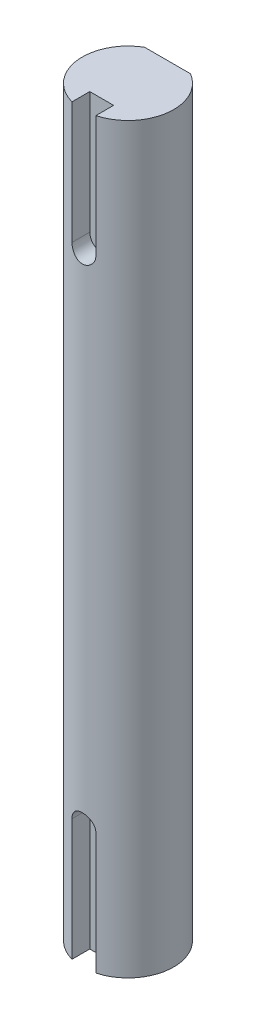
ISO-10303-21;
HEADER;
FILE_DESCRIPTION(('STEP AP214'),'2;1');
FILE_NAME('part.step','',(''),(''),'','','');
FILE_SCHEMA(('AUTOMOTIVE_DESIGN { 1 0 10303 214 1 1 1 1 }'));
ENDSEC;
DATA;
#1=APPLICATION_CONTEXT('core data for automotive mechanical design processes');
#2=APPLICATION_PROTOCOL_DEFINITION('international standard','automotive_design',2000,#1);
#3=PRODUCT_CONTEXT('',#1,'mechanical');
#4=PRODUCT('Part','Part','',(#3));
#5=PRODUCT_RELATED_PRODUCT_CATEGORY('part','',(#4));
#6=PRODUCT_DEFINITION_FORMATION('','',#4);
#7=PRODUCT_DEFINITION_CONTEXT('part definition',#1,'design');
#8=PRODUCT_DEFINITION('design','',#6,#7);
#9=PRODUCT_DEFINITION_SHAPE('','',#8);
#10=(LENGTH_UNIT() NAMED_UNIT(*) SI_UNIT(.MILLI.,.METRE.));
#11=(NAMED_UNIT(*) PLANE_ANGLE_UNIT() SI_UNIT($,.RADIAN.));
#12=(NAMED_UNIT(*) SI_UNIT($,.STERADIAN.) SOLID_ANGLE_UNIT());
#13=UNCERTAINTY_MEASURE_WITH_UNIT(LENGTH_MEASURE(1.E-05),#10,'distance_accuracy_value','');
#14=(GEOMETRIC_REPRESENTATION_CONTEXT(3) GLOBAL_UNCERTAINTY_ASSIGNED_CONTEXT((#13)) GLOBAL_UNIT_ASSIGNED_CONTEXT((#10,
#11,#12)) REPRESENTATION_CONTEXT('',''));
#15=CARTESIAN_POINT('',(0.,0.,0.));
#16=DIRECTION('',(0.,0.,1.));
#17=DIRECTION('',(1.,0.,0.));
#18=AXIS2_PLACEMENT_3D('',#15,#16,#17);
#19=CARTESIAN_POINT('',(0.,-38.735,0.));
#20=DIRECTION('',(0.,1.,0.));
#21=DIRECTION('',(0.,0.,1.));
#22=AXIS2_PLACEMENT_3D('',#19,#20,#21);
#23=CYLINDRICAL_SURFACE('',#22,4.7625);
#24=DIRECTION('',(0.,1.,0.));
#25=VECTOR('',#24,1.);
#26=CARTESIAN_POINT('',(1.24459999999999,-38.735,4.5969965292569));
#27=LINE('',#26,#25);
#28=CARTESIAN_POINT('',(1.2446,26.035,4.5969965292569));
#29=VERTEX_POINT('',#28);
#30=CARTESIAN_POINT('',(1.2446,38.735,4.5969965292569));
#31=VERTEX_POINT('',#30);
#32=EDGE_CURVE('E152',#29,#31,#27,.T.);
#33=ORIENTED_EDGE('',*,*,#32,.F.);
#34=CARTESIAN_POINT('',(1.2446,26.035,4.5969965292569));
#35=CARTESIAN_POINT('',(1.24460048069691,26.0006255628231,4.59699408376007));
#36=CARTESIAN_POINT('',(1.24317501700129,25.966268215999,4.5973825759876));
#37=CARTESIAN_POINT('',(1.23749293849502,25.8978115705428,4.59891621742561));
#38=CARTESIAN_POINT('',(1.23323683326576,25.8637122265814,4.60006123044449));
#39=CARTESIAN_POINT('',(1.21628657128937,25.7623198325488,4.60458446129686));
#40=CARTESIAN_POINT('',(1.19941017764007,25.6957252822143,4.60905116855804));
#41=CARTESIAN_POINT('',(1.15505827670811,25.5664412354433,4.62036394290255));
#42=CARTESIAN_POINT('',(1.12758433099319,25.5037511652548,4.62720965942));
#43=CARTESIAN_POINT('',(1.06285289634498,25.3838354583918,4.64250499373342));
#44=CARTESIAN_POINT('',(1.02559237402981,25.3266115234763,4.65095510859255));
#45=CARTESIAN_POINT('',(0.941398979907101,25.2179168005052,4.66873215221298));
#46=CARTESIAN_POINT('',(0.894275059322025,25.1665964795985,4.67807404656334));
#47=CARTESIAN_POINT('',(0.792099451869523,25.0724863600209,4.69645346192189));
#48=CARTESIAN_POINT('',(0.737046487215499,25.0296979389436,4.70549093358134));
#49=CARTESIAN_POINT('',(0.619532028480514,24.9532437325057,4.72241023124279));
#50=CARTESIAN_POINT('',(0.556969876173491,24.9197278955072,4.73027221144797));
#51=CARTESIAN_POINT('',(0.426862239969756,24.863748321937,4.74378179788506));
#52=CARTESIAN_POINT('',(0.359317803810612,24.8412822692537,4.74942986811743));
#53=CARTESIAN_POINT('',(0.222739671845817,24.8085259648376,4.75776932421329));
#54=CARTESIAN_POINT('',(0.153771576200012,24.7979783557913,4.76052311140348));
#55=CARTESIAN_POINT('',(0.0149919824848408,24.7885491757278,4.7629816983899));
#56=CARTESIAN_POINT('',(-0.0548193968975559,24.7896659816924,4.76268692237153));
#57=CARTESIAN_POINT('',(-0.191511566074036,24.8033518915091,4.75912743579705));
#58=CARTESIAN_POINT('',(-0.258422375590347,24.8156427819586,4.75593487759589));
#59=CARTESIAN_POINT('',(-0.389196035092339,24.850879106172,4.74702336680663));
#60=CARTESIAN_POINT('',(-0.4530587433749,24.8738250347469,4.74130429689009));
#61=CARTESIAN_POINT('',(-0.576642455622934,24.929937439557,4.72787417183306));
#62=CARTESIAN_POINT('',(-0.63631745814736,24.9632005654322,4.72014439617784));
#63=CARTESIAN_POINT('',(-0.749333048347102,25.0389287146211,4.70352780085098));
#64=CARTESIAN_POINT('',(-0.802672575468966,25.0813952752311,4.69464078797928));
#65=CARTESIAN_POINT('',(-0.903159231271162,25.1758006923784,4.67636584182586));
#66=CARTESIAN_POINT('',(-0.950078078364809,25.2279814181199,4.6669708633435));
#67=CARTESIAN_POINT('',(-1.03456387629524,25.3395829088986,4.64897360387142));
#68=CARTESIAN_POINT('',(-1.07212825101057,25.3990056616171,4.64037154165222));
#69=CARTESIAN_POINT('',(-1.13700674989337,25.5238939038961,4.62490490570996));
#70=CARTESIAN_POINT('',(-1.164255378317,25.589394821719,4.61805152116702));
#71=CARTESIAN_POINT('',(-1.20724593796408,25.7242334511026,4.6070016754561));
#72=CARTESIAN_POINT('',(-1.22300512439392,25.7935652401585,4.60280123129246));
#73=CARTESIAN_POINT('',(-1.23670202917591,25.8920901866401,4.59912882560274));
#74=CARTESIAN_POINT('',(-1.23966411940503,25.9206090697454,4.59833055320323));
#75=CARTESIAN_POINT('',(-1.2436109644293,25.9777473867567,4.59726458179524));
#76=CARTESIAN_POINT('',(-1.2445988719784,26.0063665871042,4.59699603682516));
#77=CARTESIAN_POINT('',(-1.2446,26.035,4.5969965292569));
#78=B_SPLINE_CURVE_WITH_KNOTS('',3,(#34,#35,#36,#37,#38,#39,#40,#41,#42,#43,#44,#45,#46,#47,#48,
#49,#50,#51,#52,#53,#54,#55,#56,#57,#58,#59,#60,#61,#62,#63,#64,#65,#66,#67,#68,#69,#70,#71,#72,
#73,#74,#75,#76,#77),.UNSPECIFIED.,.F.,.F.,(4,2,2,2,2,2,2,2,2,2,2,2,2,2,2,2,2,2,2,2,2,4),(0.,
0.103057985094989,0.206097422372695,0.411563016689937,0.616998346852772,0.822497427674441,
1.03242281078854,1.24238206186975,1.45556084737979,1.66869493007218,1.87713314182961,
2.085542351316,2.28890056394074,2.49226822129154,2.69760166578283,2.90296943462697,
3.11437766883767,3.32584405838716,3.53863140900513,3.7510985268427,3.83708969411534,
3.92294342408338),.UNSPECIFIED.);
#79=CARTESIAN_POINT('',(-1.2446,26.035,4.5969965292569));
#80=VERTEX_POINT('',#79);
#81=EDGE_CURVE('E12',#29,#80,#78,.T.);
#82=ORIENTED_EDGE('',*,*,#81,.T.);
#83=DIRECTION('',(0.,1.,0.));
#84=VECTOR('',#83,1.);
#85=CARTESIAN_POINT('',(-1.2446,-38.735,4.5969965292569));
#86=LINE('',#85,#84);
#87=CARTESIAN_POINT('',(-1.2446,38.735,4.5969965292569));
#88=VERTEX_POINT('',#87);
#89=EDGE_CURVE('E150',#80,#88,#86,.T.);
#90=ORIENTED_EDGE('',*,*,#89,.T.);
#91=CARTESIAN_POINT('',(0.,38.735,0.));
#92=DIRECTION('',(0.,1.,0.));
#93=DIRECTION('',(0.,0.,1.));
#94=AXIS2_PLACEMENT_3D('',#91,#92,#93);
#95=CIRCLE('',#94,4.7625);
#96=CARTESIAN_POINT('',(-2.3876,38.735,-4.12077328786722));
#97=VERTEX_POINT('',#96);
#98=EDGE_CURVE('E193',#97,#88,#95,.T.);
#99=ORIENTED_EDGE('',*,*,#98,.F.);
#100=DIRECTION('',(0.,1.,0.));
#101=VECTOR('',#100,1.);
#102=CARTESIAN_POINT('',(-2.3876,-38.735,-4.12077328786722));
#103=LINE('',#102,#101);
#104=CARTESIAN_POINT('',(-2.3876,-38.735,-4.12077328786722));
#105=VERTEX_POINT('',#104);
#106=EDGE_CURVE('E203',#105,#97,#103,.T.);
#107=ORIENTED_EDGE('',*,*,#106,.F.);
#108=CARTESIAN_POINT('',(0.,-38.735,0.));
#109=DIRECTION('',(0.,1.,0.));
#110=DIRECTION('',(0.,0.,1.));
#111=AXIS2_PLACEMENT_3D('',#108,#109,#110);
#112=CIRCLE('',#111,4.7625);
#113=CARTESIAN_POINT('',(-1.2446,-38.735,4.5969965292569));
#114=VERTEX_POINT('',#113);
#115=EDGE_CURVE('E200',#105,#114,#112,.T.);
#116=ORIENTED_EDGE('',*,*,#115,.T.);
#117=DIRECTION('',(0.,1.,0.));
#118=VECTOR('',#117,1.);
#119=CARTESIAN_POINT('',(-1.2446,-38.735,4.5969965292569));
#120=LINE('',#119,#118);
#121=CARTESIAN_POINT('',(-1.2446,-26.035,4.5969965292569));
#122=VERTEX_POINT('',#121);
#123=EDGE_CURVE('E80',#122,#114,#120,.F.);
#124=ORIENTED_EDGE('',*,*,#123,.F.);
#125=CARTESIAN_POINT('',(-1.2446,-26.035,4.5969965292569));
#126=CARTESIAN_POINT('',(-1.24460048069691,-26.0006255628231,4.59699408376007));
#127=CARTESIAN_POINT('',(-1.24317501700129,-25.966268215999,4.5973825759876));
#128=CARTESIAN_POINT('',(-1.23749293849502,-25.8978115705428,4.59891621742561));
#129=CARTESIAN_POINT('',(-1.23323683326577,-25.8637122265814,4.60006123044449));
#130=CARTESIAN_POINT('',(-1.21628657128937,-25.7623198325488,4.60458446129686));
#131=CARTESIAN_POINT('',(-1.19941017764007,-25.6957252822143,4.60905116855804));
#132=CARTESIAN_POINT('',(-1.15505827670811,-25.5664412354433,4.62036394290254));
#133=CARTESIAN_POINT('',(-1.12758433099319,-25.5037511652548,4.62720965942));
#134=CARTESIAN_POINT('',(-1.06285289634498,-25.3838354583918,4.64250499373342));
#135=CARTESIAN_POINT('',(-1.02559237402982,-25.3266115234763,4.65095510859255));
#136=CARTESIAN_POINT('',(-0.941398979907102,-25.2179168005052,4.66873215221298));
#137=CARTESIAN_POINT('',(-0.894275059322026,-25.1665964795985,4.67807404656334));
#138=CARTESIAN_POINT('',(-0.792099451869525,-25.0724863600209,4.69645346192189));
#139=CARTESIAN_POINT('',(-0.737046487215504,-25.0296979389436,4.70549093358134));
#140=CARTESIAN_POINT('',(-0.619532028480519,-24.9532437325057,4.72241023124279));
#141=CARTESIAN_POINT('',(-0.556969876173495,-24.9197278955072,4.73027221144797));
#142=CARTESIAN_POINT('',(-0.426862239969759,-24.863748321937,4.74378179788506));
#143=CARTESIAN_POINT('',(-0.359317803810614,-24.8412822692537,4.74942986811743));
#144=CARTESIAN_POINT('',(-0.222739671845819,-24.8085259648376,4.75776932421329));
#145=CARTESIAN_POINT('',(-0.153771576200013,-24.7979783557913,4.76052311140348));
#146=CARTESIAN_POINT('',(-0.014991982484842,-24.7885491757278,4.7629816983899));
#147=CARTESIAN_POINT('',(0.0548193968975547,-24.7896659816924,4.76268692237153));
#148=CARTESIAN_POINT('',(0.191511566074035,-24.8033518915091,4.75912743579705));
#149=CARTESIAN_POINT('',(0.258422375590346,-24.8156427819586,4.75593487759589));
#150=CARTESIAN_POINT('',(0.389196035092338,-24.850879106172,4.74702336680663));
#151=CARTESIAN_POINT('',(0.4530587433749,-24.8738250347469,4.74130429689009));
#152=CARTESIAN_POINT('',(0.576642455622933,-24.929937439557,4.72787417183306));
#153=CARTESIAN_POINT('',(0.63631745814736,-24.9632005654322,4.72014439617784));
#154=CARTESIAN_POINT('',(0.749333048347103,-25.0389287146211,4.70352780085098));
#155=CARTESIAN_POINT('',(0.802672575468967,-25.0813952752311,4.69464078797928));
#156=CARTESIAN_POINT('',(0.903159231271163,-25.1758006923784,4.67636584182586));
#157=CARTESIAN_POINT('',(0.950078078364809,-25.2279814181199,4.6669708633435));
#158=CARTESIAN_POINT('',(1.03456387629524,-25.3395829088986,4.64897360387142));
#159=CARTESIAN_POINT('',(1.07212825101057,-25.3990056616171,4.64037154165222));
#160=CARTESIAN_POINT('',(1.13700674989337,-25.5238939038961,4.62490490570996));
#161=CARTESIAN_POINT('',(1.164255378317,-25.589394821719,4.61805152116702));
#162=CARTESIAN_POINT('',(1.20724593796408,-25.7242334511027,4.6070016754561));
#163=CARTESIAN_POINT('',(1.22300512439392,-25.7935652401585,4.60280123129246));
#164=CARTESIAN_POINT('',(1.23670202917591,-25.8920901866401,4.59912882560274));
#165=CARTESIAN_POINT('',(1.23966411940503,-25.9206090697454,4.59833055320323));
#166=CARTESIAN_POINT('',(1.24361096442929,-25.9777473867567,4.59726458179524));
#167=CARTESIAN_POINT('',(1.2445988719784,-26.0063665871042,4.59699603682516));
#168=CARTESIAN_POINT('',(1.2446,-26.035,4.5969965292569));
#169=B_SPLINE_CURVE_WITH_KNOTS('',3,(#125,#126,#127,#128,#129,#130,#131,#132,#133,#134,#135,
#136,#137,#138,#139,#140,#141,#142,#143,#144,#145,#146,#147,#148,#149,#150,#151,#152,#153,#154,
#155,#156,#157,#158,#159,#160,#161,#162,#163,#164,#165,#166,#167,#168),.UNSPECIFIED.,.F.,.F.,(4,
2,2,2,2,2,2,2,2,2,2,2,2,2,2,2,2,2,2,2,2,4),(0.,0.103057985094989,0.206097422372695,
0.411563016689937,0.616998346852772,0.822497427674441,1.03242281078854,1.24238206186975,
1.45556084737979,1.66869493007218,1.87713314182961,2.085542351316,2.28890056394074,
2.49226822129154,2.69760166578283,2.90296943462698,3.11437766883767,3.32584405838715,
3.53863140900514,3.7510985268427,3.83708969411534,3.92294342408338),.UNSPECIFIED.);
#170=CARTESIAN_POINT('',(1.2446,-26.035,4.5969965292569));
#171=VERTEX_POINT('',#170);
#172=EDGE_CURVE('E73',#122,#171,#169,.T.);
#173=ORIENTED_EDGE('',*,*,#172,.T.);
#174=DIRECTION('',(0.,1.,0.));
#175=VECTOR('',#174,1.);
#176=CARTESIAN_POINT('',(1.2446,-38.735,4.5969965292569));
#177=LINE('',#176,#175);
#178=CARTESIAN_POINT('',(1.2446,-38.735,4.5969965292569));
#179=VERTEX_POINT('',#178);
#180=EDGE_CURVE('E186',#171,#179,#177,.F.);
#181=ORIENTED_EDGE('',*,*,#180,.T.);
#182=CARTESIAN_POINT('',(2.3876,-38.735,-4.12077328786722));
#183=VERTEX_POINT('',#182);
#184=EDGE_CURVE('E199',#179,#183,#112,.T.);
#185=ORIENTED_EDGE('',*,*,#184,.T.);
#186=DIRECTION('',(0.,1.,0.));
#187=VECTOR('',#186,1.);
#188=CARTESIAN_POINT('',(2.3876,-38.735,-4.12077328786722));
#189=LINE('',#188,#187);
#190=CARTESIAN_POINT('',(2.3876,38.735,-4.12077328786722));
#191=VERTEX_POINT('',#190);
#192=EDGE_CURVE('E204',#183,#191,#189,.T.);
#193=ORIENTED_EDGE('',*,*,#192,.T.);
#194=EDGE_CURVE('E192',#31,#191,#95,.T.);
#195=ORIENTED_EDGE('',*,*,#194,.F.);
#196=EDGE_LOOP('',(#33,#82,#90,#99,#107,#116,#124,#173,#181,#185,#193,#195));
#197=FACE_BOUND('',#196,.T.);
#198=ADVANCED_FACE('F60',(#197),#23,.T.);
#199=CARTESIAN_POINT('',(0.,-38.735,0.));
#200=DIRECTION('',(0.,1.,0.));
#201=DIRECTION('',(0.,0.,1.));
#202=AXIS2_PLACEMENT_3D('',#199,#200,#201);
#203=PLANE('',#202);
#204=DIRECTION('',(0.,0.,1.));
#205=VECTOR('',#204,1.);
#206=CARTESIAN_POINT('',(1.2446,-38.735,0.));
#207=LINE('',#206,#205);
#208=CARTESIAN_POINT('',(1.2446,-38.735,2.7432));
#209=VERTEX_POINT('',#208);
#210=EDGE_CURVE('E214',#209,#179,#207,.T.);
#211=ORIENTED_EDGE('',*,*,#210,.F.);
#212=DIRECTION('',(1.,0.,0.));
#213=VECTOR('',#212,1.);
#214=CARTESIAN_POINT('',(0.,-38.735,2.7432));
#215=LINE('',#214,#213);
#216=CARTESIAN_POINT('',(-1.2446,-38.735,2.7432));
#217=VERTEX_POINT('',#216);
#218=EDGE_CURVE('E176',#217,#209,#215,.T.);
#219=ORIENTED_EDGE('',*,*,#218,.F.);
#220=DIRECTION('',(0.,0.,1.));
#221=VECTOR('',#220,1.);
#222=CARTESIAN_POINT('',(-1.2446,-38.735,0.));
#223=LINE('',#222,#221);
#224=EDGE_CURVE('E212',#217,#114,#223,.T.);
#225=ORIENTED_EDGE('',*,*,#224,.T.);
#226=ORIENTED_EDGE('',*,*,#115,.F.);
#227=DIRECTION('',(1.,0.,0.));
#228=VECTOR('',#227,1.);
#229=CARTESIAN_POINT('',(0.,-38.735,-4.12077328786722));
#230=LINE('',#229,#228);
#231=EDGE_CURVE('E196',#105,#183,#230,.T.);
#232=ORIENTED_EDGE('',*,*,#231,.T.);
#233=ORIENTED_EDGE('',*,*,#184,.F.);
#234=EDGE_LOOP('',(#211,#219,#225,#226,#232,#233));
#235=FACE_BOUND('',#234,.T.);
#236=ADVANCED_FACE('F242',(#235),#203,.F.);
#237=CARTESIAN_POINT('',(0.,38.735,0.));
#238=DIRECTION('',(0.,1.,0.));
#239=DIRECTION('',(0.,0.,1.));
#240=AXIS2_PLACEMENT_3D('',#237,#238,#239);
#241=PLANE('',#240);
#242=ORIENTED_EDGE('',*,*,#98,.T.);
#243=DIRECTION('',(0.,0.,-1.));
#244=VECTOR('',#243,1.);
#245=CARTESIAN_POINT('',(-1.2446,38.735,0.));
#246=LINE('',#245,#244);
#247=CARTESIAN_POINT('',(-1.2446,38.735,2.7432));
#248=VERTEX_POINT('',#247);
#249=EDGE_CURVE('E210',#88,#248,#246,.T.);
#250=ORIENTED_EDGE('',*,*,#249,.T.);
#251=DIRECTION('',(1.,0.,0.));
#252=VECTOR('',#251,1.);
#253=CARTESIAN_POINT('',(0.,38.735,2.7432));
#254=LINE('',#253,#252);
#255=CARTESIAN_POINT('',(1.2446,38.735,2.7432));
#256=VERTEX_POINT('',#255);
#257=EDGE_CURVE('E161',#248,#256,#254,.T.);
#258=ORIENTED_EDGE('',*,*,#257,.T.);
#259=DIRECTION('',(0.,0.,-1.));
#260=VECTOR('',#259,1.);
#261=CARTESIAN_POINT('',(1.2446,38.735,0.));
#262=LINE('',#261,#260);
#263=EDGE_CURVE('E207',#31,#256,#262,.T.);
#264=ORIENTED_EDGE('',*,*,#263,.F.);
#265=ORIENTED_EDGE('',*,*,#194,.T.);
#266=DIRECTION('',(1.,0.,0.));
#267=VECTOR('',#266,1.);
#268=CARTESIAN_POINT('',(0.,38.735,-4.12077328786722));
#269=LINE('',#268,#267);
#270=EDGE_CURVE('E189',#97,#191,#269,.T.);
#271=ORIENTED_EDGE('',*,*,#270,.F.);
#272=EDGE_LOOP('',(#242,#250,#258,#264,#265,#271));
#273=FACE_BOUND('',#272,.T.);
#274=ADVANCED_FACE('F240',(#273),#241,.T.);
#275=CARTESIAN_POINT('',(0.,-38.735,-4.12077328786722));
#276=DIRECTION('',(0.,0.,1.));
#277=DIRECTION('',(1.,0.,0.));
#278=AXIS2_PLACEMENT_3D('',#275,#276,#277);
#279=PLANE('',#278);
#280=ORIENTED_EDGE('',*,*,#106,.T.);
#281=ORIENTED_EDGE('',*,*,#270,.T.);
#282=ORIENTED_EDGE('',*,*,#192,.F.);
#283=ORIENTED_EDGE('',*,*,#231,.F.);
#284=EDGE_LOOP('',(#280,#281,#282,#283));
#285=FACE_BOUND('',#284,.T.);
#286=ADVANCED_FACE('F62',(#285),#279,.F.);
#287=CARTESIAN_POINT('',(-1.2446,0.,4.7625));
#288=DIRECTION('',(1.,0.,0.));
#289=DIRECTION('',(0.,1.,0.));
#290=AXIS2_PLACEMENT_3D('',#287,#288,#289);
#291=PLANE('',#290);
#292=DIRECTION('',(0.,0.,-1.));
#293=VECTOR('',#292,1.);
#294=CARTESIAN_POINT('',(-1.2446,26.035,4.7625));
#295=LINE('',#294,#293);
#296=CARTESIAN_POINT('',(-1.2446,26.035,2.7432));
#297=VERTEX_POINT('',#296);
#298=EDGE_CURVE('E144',#80,#297,#295,.T.);
#299=ORIENTED_EDGE('',*,*,#298,.T.);
#300=DIRECTION('',(0.,-1.,0.));
#301=VECTOR('',#300,1.);
#302=CARTESIAN_POINT('',(-1.2446,0.,2.7432));
#303=LINE('',#302,#301);
#304=EDGE_CURVE('E148',#248,#297,#303,.T.);
#305=ORIENTED_EDGE('',*,*,#304,.F.);
#306=ORIENTED_EDGE('',*,*,#249,.F.);
#307=ORIENTED_EDGE('',*,*,#89,.F.);
#308=EDGE_LOOP('',(#299,#305,#306,#307));
#309=FACE_BOUND('',#308,.T.);
#310=ADVANCED_FACE('F146',(#309),#291,.T.);
#311=CARTESIAN_POINT('',(0.,26.035,4.7625));
#312=DIRECTION('',(0.,0.,-1.));
#313=DIRECTION('',(-1.,0.,0.));
#314=AXIS2_PLACEMENT_3D('',#311,#312,#313);
#315=CYLINDRICAL_SURFACE('',#314,1.2446);
#316=DIRECTION('',(0.,0.,-1.));
#317=VECTOR('',#316,1.);
#318=CARTESIAN_POINT('',(1.2446,26.035,4.7625));
#319=LINE('',#318,#317);
#320=CARTESIAN_POINT('',(1.2446,26.035,2.7432));
#321=VERTEX_POINT('',#320);
#322=EDGE_CURVE('E153',#29,#321,#319,.T.);
#323=ORIENTED_EDGE('',*,*,#322,.T.);
#324=CARTESIAN_POINT('',(0.,26.035,2.7432));
#325=DIRECTION('',(0.,0.,1.));
#326=DIRECTION('',(1.,0.,0.));
#327=AXIS2_PLACEMENT_3D('',#324,#325,#326);
#328=CIRCLE('',#327,1.2446);
#329=EDGE_CURVE('E155',#297,#321,#328,.T.);
#330=ORIENTED_EDGE('',*,*,#329,.F.);
#331=ORIENTED_EDGE('',*,*,#298,.F.);
#332=ORIENTED_EDGE('',*,*,#81,.F.);
#333=EDGE_LOOP('',(#323,#330,#331,#332));
#334=FACE_BOUND('',#333,.T.);
#335=ADVANCED_FACE('F156',(#334),#315,.F.);
#336=CARTESIAN_POINT('',(1.24459999999999,0.,4.7625));
#337=DIRECTION('',(1.,0.,0.));
#338=DIRECTION('',(0.,1.,0.));
#339=AXIS2_PLACEMENT_3D('',#336,#337,#338);
#340=PLANE('',#339);
#341=ORIENTED_EDGE('',*,*,#32,.T.);
#342=ORIENTED_EDGE('',*,*,#263,.T.);
#343=DIRECTION('',(0.,-1.,0.));
#344=VECTOR('',#343,1.);
#345=CARTESIAN_POINT('',(1.24459999999999,0.,2.7432));
#346=LINE('',#345,#344);
#347=EDGE_CURVE('E88',#256,#321,#346,.T.);
#348=ORIENTED_EDGE('',*,*,#347,.T.);
#349=ORIENTED_EDGE('',*,*,#322,.F.);
#350=EDGE_LOOP('',(#341,#342,#348,#349));
#351=FACE_BOUND('',#350,.T.);
#352=ADVANCED_FACE('F267',(#351),#340,.F.);
#353=CARTESIAN_POINT('',(0.,0.,2.7432));
#354=DIRECTION('',(0.,0.,1.));
#355=DIRECTION('',(1.,0.,0.));
#356=AXIS2_PLACEMENT_3D('',#353,#354,#355);
#357=PLANE('',#356);
#358=ORIENTED_EDGE('',*,*,#304,.T.);
#359=ORIENTED_EDGE('',*,*,#329,.T.);
#360=ORIENTED_EDGE('',*,*,#347,.F.);
#361=ORIENTED_EDGE('',*,*,#257,.F.);
#362=EDGE_LOOP('',(#358,#359,#360,#361));
#363=FACE_BOUND('',#362,.T.);
#364=ADVANCED_FACE('F159',(#363),#357,.T.);
#365=CARTESIAN_POINT('',(0.,0.,2.7432));
#366=DIRECTION('',(0.,0.,1.));
#367=DIRECTION('',(1.,0.,0.));
#368=AXIS2_PLACEMENT_3D('',#365,#366,#367);
#369=PLANE('',#368);
#370=CARTESIAN_POINT('',(0.,-26.035,2.7432));
#371=DIRECTION('',(0.,0.,1.));
#372=DIRECTION('',(1.,0.,0.));
#373=AXIS2_PLACEMENT_3D('',#370,#371,#372);
#374=CIRCLE('',#373,1.2446);
#375=CARTESIAN_POINT('',(1.2446,-26.035,2.7432));
#376=VERTEX_POINT('',#375);
#377=CARTESIAN_POINT('',(-1.2446,-26.035,2.7432));
#378=VERTEX_POINT('',#377);
#379=EDGE_CURVE('E163',#376,#378,#374,.T.);
#380=ORIENTED_EDGE('',*,*,#379,.T.);
#381=DIRECTION('',(0.,1.,0.));
#382=VECTOR('',#381,1.);
#383=CARTESIAN_POINT('',(-1.2446,0.,2.7432));
#384=LINE('',#383,#382);
#385=EDGE_CURVE('E178',#217,#378,#384,.T.);
#386=ORIENTED_EDGE('',*,*,#385,.F.);
#387=ORIENTED_EDGE('',*,*,#218,.T.);
#388=DIRECTION('',(0.,1.,0.));
#389=VECTOR('',#388,1.);
#390=CARTESIAN_POINT('',(1.2446,0.,2.7432));
#391=LINE('',#390,#389);
#392=EDGE_CURVE('E166',#209,#376,#391,.T.);
#393=ORIENTED_EDGE('',*,*,#392,.T.);
#394=EDGE_LOOP('',(#380,#386,#387,#393));
#395=FACE_BOUND('',#394,.T.);
#396=ADVANCED_FACE('F230',(#395),#369,.T.);
#397=CARTESIAN_POINT('',(1.2446,0.,4.7625));
#398=DIRECTION('',(-1.,0.,0.));
#399=DIRECTION('',(0.,-1.,0.));
#400=AXIS2_PLACEMENT_3D('',#397,#398,#399);
#401=PLANE('',#400);
#402=DIRECTION('',(0.,0.,-1.));
#403=VECTOR('',#402,1.);
#404=CARTESIAN_POINT('',(1.2446,-26.035,4.7625));
#405=LINE('',#404,#403);
#406=EDGE_CURVE('E172',#171,#376,#405,.T.);
#407=ORIENTED_EDGE('',*,*,#406,.T.);
#408=ORIENTED_EDGE('',*,*,#392,.F.);
#409=ORIENTED_EDGE('',*,*,#210,.T.);
#410=ORIENTED_EDGE('',*,*,#180,.F.);
#411=EDGE_LOOP('',(#407,#408,#409,#410));
#412=FACE_BOUND('',#411,.T.);
#413=ADVANCED_FACE('F231',(#412),#401,.T.);
#414=CARTESIAN_POINT('',(-1.2446,0.,4.7625));
#415=DIRECTION('',(-1.,0.,0.));
#416=DIRECTION('',(0.,0.,1.));
#417=AXIS2_PLACEMENT_3D('',#414,#415,#416);
#418=PLANE('',#417);
#419=ORIENTED_EDGE('',*,*,#123,.T.);
#420=ORIENTED_EDGE('',*,*,#224,.F.);
#421=ORIENTED_EDGE('',*,*,#385,.T.);
#422=DIRECTION('',(0.,0.,-1.));
#423=VECTOR('',#422,1.);
#424=CARTESIAN_POINT('',(-1.2446,-26.035,4.7625));
#425=LINE('',#424,#423);
#426=EDGE_CURVE('E174',#122,#378,#425,.T.);
#427=ORIENTED_EDGE('',*,*,#426,.F.);
#428=EDGE_LOOP('',(#419,#420,#421,#427));
#429=FACE_BOUND('',#428,.T.);
#430=ADVANCED_FACE('F228',(#429),#418,.F.);
#431=CARTESIAN_POINT('',(0.,-26.035,4.7625));
#432=DIRECTION('',(0.,0.,-1.));
#433=DIRECTION('',(-1.,0.,0.));
#434=AXIS2_PLACEMENT_3D('',#431,#432,#433);
#435=CYLINDRICAL_SURFACE('',#434,1.2446);
#436=ORIENTED_EDGE('',*,*,#426,.T.);
#437=ORIENTED_EDGE('',*,*,#379,.F.);
#438=ORIENTED_EDGE('',*,*,#406,.F.);
#439=ORIENTED_EDGE('',*,*,#172,.F.);
#440=EDGE_LOOP('',(#436,#437,#438,#439));
#441=FACE_BOUND('',#440,.T.);
#442=ADVANCED_FACE('F223',(#441),#435,.F.);
#443=CLOSED_SHELL('',(#198,#236,#274,#286,#310,#335,#352,#364,#396,#413,#430,#442));
#444=MANIFOLD_SOLID_BREP('B2',#443);
#445=ADVANCED_BREP_SHAPE_REPRESENTATION('',(#18,#444),#14);
#446=SHAPE_DEFINITION_REPRESENTATION(#9,#445);
ENDSEC;
END-ISO-10303-21;
